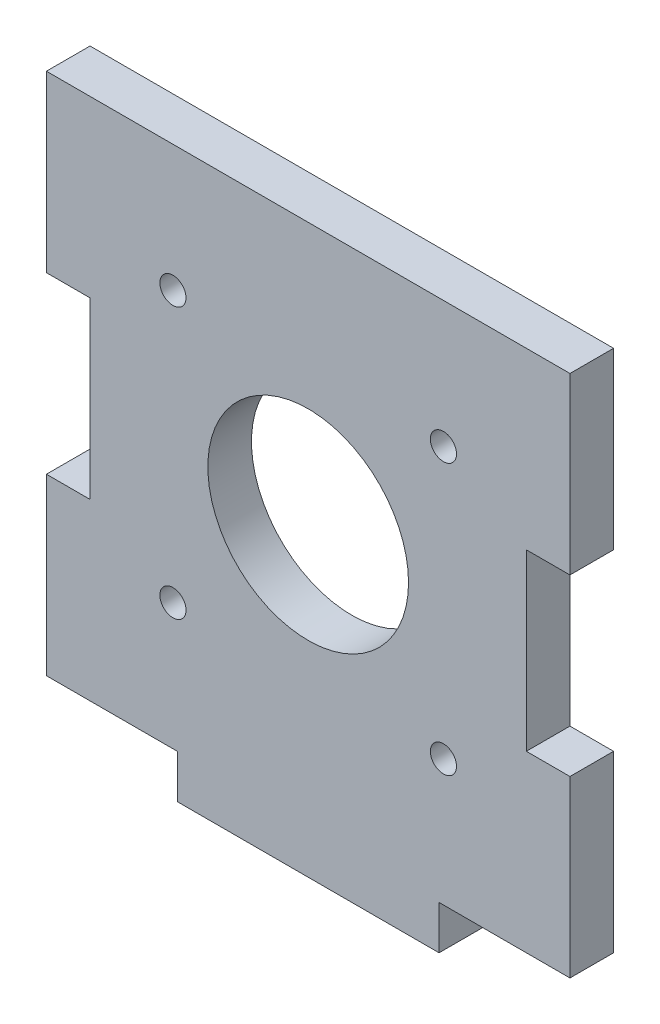
ISO-10303-21;
HEADER;
FILE_DESCRIPTION(('STEP AP214'),'2;1');
FILE_NAME('part.step','',(''),(''),'','','');
FILE_SCHEMA(('AUTOMOTIVE_DESIGN { 1 0 10303 214 1 1 1 1 }'));
ENDSEC;
DATA;
#1=APPLICATION_CONTEXT('core data for automotive mechanical design processes');
#2=APPLICATION_PROTOCOL_DEFINITION('international standard','automotive_design',2000,#1);
#3=PRODUCT_CONTEXT('',#1,'mechanical');
#4=PRODUCT('Part','Part','',(#3));
#5=PRODUCT_RELATED_PRODUCT_CATEGORY('part','',(#4));
#6=PRODUCT_DEFINITION_FORMATION('','',#4);
#7=PRODUCT_DEFINITION_CONTEXT('part definition',#1,'design');
#8=PRODUCT_DEFINITION('design','',#6,#7);
#9=PRODUCT_DEFINITION_SHAPE('','',#8);
#10=(LENGTH_UNIT() NAMED_UNIT(*) SI_UNIT(.MILLI.,.METRE.));
#11=(NAMED_UNIT(*) PLANE_ANGLE_UNIT() SI_UNIT($,.RADIAN.));
#12=(NAMED_UNIT(*) SI_UNIT($,.STERADIAN.) SOLID_ANGLE_UNIT());
#13=UNCERTAINTY_MEASURE_WITH_UNIT(LENGTH_MEASURE(1.E-05),#10,'distance_accuracy_value','');
#14=(GEOMETRIC_REPRESENTATION_CONTEXT(3) GLOBAL_UNCERTAINTY_ASSIGNED_CONTEXT((#13)) GLOBAL_UNIT_ASSIGNED_CONTEXT((#10,
#11,#12)) REPRESENTATION_CONTEXT('',''));
#15=CARTESIAN_POINT('',(0.,0.,0.));
#16=DIRECTION('',(0.,0.,1.));
#17=DIRECTION('',(1.,0.,0.));
#18=AXIS2_PLACEMENT_3D('',#15,#16,#17);
#19=CARTESIAN_POINT('',(0.,0.,5.));
#20=DIRECTION('',(0.,0.,-1.));
#21=DIRECTION('',(-1.,0.,0.));
#22=AXIS2_PLACEMENT_3D('',#19,#20,#21);
#23=PLANE('',#22);
#24=DIRECTION('',(0.,-1.,0.));
#25=VECTOR('',#24,1.);
#26=CARTESIAN_POINT('',(0.,0.,5.));
#27=LINE('',#26,#25);
#28=CARTESIAN_POINT('',(0.,20.,5.));
#29=VERTEX_POINT('',#28);
#30=CARTESIAN_POINT('',(0.,0.,5.));
#31=VERTEX_POINT('',#30);
#32=EDGE_CURVE('E213',#29,#31,#27,.T.);
#33=ORIENTED_EDGE('',*,*,#32,.T.);
#34=DIRECTION('',(1.,0.,0.));
#35=VECTOR('',#34,1.);
#36=CARTESIAN_POINT('',(0.,0.,5.));
#37=LINE('',#36,#35);
#38=CARTESIAN_POINT('',(15.,0.,5.));
#39=VERTEX_POINT('',#38);
#40=EDGE_CURVE('E121',#31,#39,#37,.T.);
#41=ORIENTED_EDGE('',*,*,#40,.T.);
#42=DIRECTION('',(0.,-1.,0.));
#43=VECTOR('',#42,1.);
#44=CARTESIAN_POINT('',(15.,0.,5.));
#45=LINE('',#44,#43);
#46=CARTESIAN_POINT('',(15.,-5.,5.));
#47=VERTEX_POINT('',#46);
#48=EDGE_CURVE('E252',#39,#47,#45,.T.);
#49=ORIENTED_EDGE('',*,*,#48,.T.);
#50=DIRECTION('',(1.,0.,0.));
#51=VECTOR('',#50,1.);
#52=CARTESIAN_POINT('',(15.,-5.,5.));
#53=LINE('',#52,#51);
#54=CARTESIAN_POINT('',(45.,-5.,5.));
#55=VERTEX_POINT('',#54);
#56=EDGE_CURVE('E271',#47,#55,#53,.T.);
#57=ORIENTED_EDGE('',*,*,#56,.T.);
#58=DIRECTION('',(0.,1.,0.));
#59=VECTOR('',#58,1.);
#60=CARTESIAN_POINT('',(45.,0.,5.));
#61=LINE('',#60,#59);
#62=CARTESIAN_POINT('',(45.,0.,5.));
#63=VERTEX_POINT('',#62);
#64=EDGE_CURVE('E268',#55,#63,#61,.T.);
#65=ORIENTED_EDGE('',*,*,#64,.T.);
#66=DIRECTION('',(1.,0.,0.));
#67=VECTOR('',#66,1.);
#68=CARTESIAN_POINT('',(45.,0.,5.));
#69=LINE('',#68,#67);
#70=CARTESIAN_POINT('',(60.,0.,5.));
#71=VERTEX_POINT('',#70);
#72=EDGE_CURVE('E270',#63,#71,#69,.T.);
#73=ORIENTED_EDGE('',*,*,#72,.T.);
#74=DIRECTION('',(0.,1.,0.));
#75=VECTOR('',#74,1.);
#76=CARTESIAN_POINT('',(60.,0.,5.));
#77=LINE('',#76,#75);
#78=CARTESIAN_POINT('',(60.,20.,5.));
#79=VERTEX_POINT('',#78);
#80=EDGE_CURVE('E273',#71,#79,#77,.T.);
#81=ORIENTED_EDGE('',*,*,#80,.T.);
#82=DIRECTION('',(-1.,0.,0.));
#83=VECTOR('',#82,1.);
#84=CARTESIAN_POINT('',(60.,20.,5.));
#85=LINE('',#84,#83);
#86=CARTESIAN_POINT('',(55.,20.,5.));
#87=VERTEX_POINT('',#86);
#88=EDGE_CURVE('E279',#79,#87,#85,.T.);
#89=ORIENTED_EDGE('',*,*,#88,.T.);
#90=DIRECTION('',(0.,1.,0.));
#91=VECTOR('',#90,1.);
#92=CARTESIAN_POINT('',(55.,40.,5.));
#93=LINE('',#92,#91);
#94=CARTESIAN_POINT('',(55.,40.,5.));
#95=VERTEX_POINT('',#94);
#96=EDGE_CURVE('E281',#87,#95,#93,.T.);
#97=ORIENTED_EDGE('',*,*,#96,.T.);
#98=DIRECTION('',(1.,0.,0.));
#99=VECTOR('',#98,1.);
#100=CARTESIAN_POINT('',(60.,40.,5.));
#101=LINE('',#100,#99);
#102=CARTESIAN_POINT('',(60.,40.,5.));
#103=VERTEX_POINT('',#102);
#104=EDGE_CURVE('E283',#95,#103,#101,.T.);
#105=ORIENTED_EDGE('',*,*,#104,.T.);
#106=DIRECTION('',(0.,1.,0.));
#107=VECTOR('',#106,1.);
#108=CARTESIAN_POINT('',(60.,40.,5.));
#109=LINE('',#108,#107);
#110=CARTESIAN_POINT('',(60.,60.,5.));
#111=VERTEX_POINT('',#110);
#112=EDGE_CURVE('E285',#103,#111,#109,.T.);
#113=ORIENTED_EDGE('',*,*,#112,.T.);
#114=DIRECTION('',(-1.,0.,0.));
#115=VECTOR('',#114,1.);
#116=CARTESIAN_POINT('',(0.,60.,5.));
#117=LINE('',#116,#115);
#118=CARTESIAN_POINT('',(0.,60.,5.));
#119=VERTEX_POINT('',#118);
#120=EDGE_CURVE('E287',#111,#119,#117,.T.);
#121=ORIENTED_EDGE('',*,*,#120,.T.);
#122=DIRECTION('',(0.,-1.,0.));
#123=VECTOR('',#122,1.);
#124=CARTESIAN_POINT('',(0.,40.,5.));
#125=LINE('',#124,#123);
#126=CARTESIAN_POINT('',(0.,40.,5.));
#127=VERTEX_POINT('',#126);
#128=EDGE_CURVE('E164',#119,#127,#125,.T.);
#129=ORIENTED_EDGE('',*,*,#128,.T.);
#130=DIRECTION('',(1.,0.,0.));
#131=VECTOR('',#130,1.);
#132=CARTESIAN_POINT('',(0.,40.,5.));
#133=LINE('',#132,#131);
#134=CARTESIAN_POINT('',(5.,40.,5.));
#135=VERTEX_POINT('',#134);
#136=EDGE_CURVE('E158',#127,#135,#133,.T.);
#137=ORIENTED_EDGE('',*,*,#136,.T.);
#138=DIRECTION('',(0.,-1.,0.));
#139=VECTOR('',#138,1.);
#140=CARTESIAN_POINT('',(5.,40.,5.));
#141=LINE('',#140,#139);
#142=CARTESIAN_POINT('',(5.,20.,5.));
#143=VERTEX_POINT('',#142);
#144=EDGE_CURVE('E162',#135,#143,#141,.T.);
#145=ORIENTED_EDGE('',*,*,#144,.T.);
#146=DIRECTION('',(-1.,0.,0.));
#147=VECTOR('',#146,1.);
#148=CARTESIAN_POINT('',(0.,20.,5.));
#149=LINE('',#148,#147);
#150=EDGE_CURVE('E54',#143,#29,#149,.T.);
#151=ORIENTED_EDGE('',*,*,#150,.T.);
#152=EDGE_LOOP('',(#33,#41,#49,#57,#65,#73,#81,#89,#97,#105,#113,#121,#129,#137,#145,#151));
#153=FACE_BOUND('',#152,.T.);
#154=CARTESIAN_POINT('',(30.,30.,5.));
#155=DIRECTION('',(0.,0.,1.));
#156=DIRECTION('',(1.,0.,0.));
#157=AXIS2_PLACEMENT_3D('',#154,#155,#156);
#158=CIRCLE('',#157,11.5);
#159=CARTESIAN_POINT('',(41.5,30.,5.));
#160=VERTEX_POINT('',#159);
#161=EDGE_CURVE('E186',#160,#160,#158,.T.);
#162=ORIENTED_EDGE('',*,*,#161,.F.);
#163=EDGE_LOOP('',(#162));
#164=FACE_BOUND('',#163,.T.);
#165=CARTESIAN_POINT('',(14.5,45.5,5.));
#166=DIRECTION('',(0.,0.,1.));
#167=DIRECTION('',(1.,0.,0.));
#168=AXIS2_PLACEMENT_3D('',#165,#166,#167);
#169=CIRCLE('',#168,1.5);
#170=CARTESIAN_POINT('',(16.,45.5,5.));
#171=VERTEX_POINT('',#170);
#172=EDGE_CURVE('E361',#171,#171,#169,.T.);
#173=ORIENTED_EDGE('',*,*,#172,.F.);
#174=EDGE_LOOP('',(#173));
#175=FACE_BOUND('',#174,.T.);
#176=CARTESIAN_POINT('',(45.5,45.5,5.));
#177=DIRECTION('',(0.,0.,1.));
#178=DIRECTION('',(1.,0.,0.));
#179=AXIS2_PLACEMENT_3D('',#176,#177,#178);
#180=CIRCLE('',#179,1.5);
#181=CARTESIAN_POINT('',(47.,45.5,5.));
#182=VERTEX_POINT('',#181);
#183=EDGE_CURVE('E355',#182,#182,#180,.T.);
#184=ORIENTED_EDGE('',*,*,#183,.F.);
#185=EDGE_LOOP('',(#184));
#186=FACE_BOUND('',#185,.T.);
#187=CARTESIAN_POINT('',(45.5,14.5,5.));
#188=DIRECTION('',(0.,0.,1.));
#189=DIRECTION('',(1.,0.,0.));
#190=AXIS2_PLACEMENT_3D('',#187,#188,#189);
#191=CIRCLE('',#190,1.5);
#192=CARTESIAN_POINT('',(47.,14.5,5.));
#193=VERTEX_POINT('',#192);
#194=EDGE_CURVE('E349',#193,#193,#191,.T.);
#195=ORIENTED_EDGE('',*,*,#194,.F.);
#196=EDGE_LOOP('',(#195));
#197=FACE_BOUND('',#196,.T.);
#198=CARTESIAN_POINT('',(14.5,14.5,5.));
#199=DIRECTION('',(0.,0.,1.));
#200=DIRECTION('',(1.,0.,0.));
#201=AXIS2_PLACEMENT_3D('',#198,#199,#200);
#202=CIRCLE('',#201,1.5);
#203=CARTESIAN_POINT('',(16.,14.5,5.));
#204=VERTEX_POINT('',#203);
#205=EDGE_CURVE('E340',#204,#204,#202,.T.);
#206=ORIENTED_EDGE('',*,*,#205,.F.);
#207=EDGE_LOOP('',(#206));
#208=FACE_BOUND('',#207,.T.);
#209=ADVANCED_FACE('F37',(#153,#164,#175,#186,#197,#208),#23,.F.);
#210=CARTESIAN_POINT('',(0.,0.,0.));
#211=DIRECTION('',(0.,0.,-1.));
#212=DIRECTION('',(-1.,0.,0.));
#213=AXIS2_PLACEMENT_3D('',#210,#211,#212);
#214=PLANE('',#213);
#215=CARTESIAN_POINT('',(45.5,14.5,0.));
#216=DIRECTION('',(0.,0.,1.));
#217=DIRECTION('',(1.,0.,0.));
#218=AXIS2_PLACEMENT_3D('',#215,#216,#217);
#219=CIRCLE('',#218,1.5);
#220=CARTESIAN_POINT('',(47.,14.5,0.));
#221=VERTEX_POINT('',#220);
#222=EDGE_CURVE('E346',#221,#221,#219,.T.);
#223=ORIENTED_EDGE('',*,*,#222,.T.);
#224=EDGE_LOOP('',(#223));
#225=FACE_BOUND('',#224,.T.);
#226=CARTESIAN_POINT('',(14.5,45.5,0.));
#227=DIRECTION('',(0.,0.,1.));
#228=DIRECTION('',(1.,0.,0.));
#229=AXIS2_PLACEMENT_3D('',#226,#227,#228);
#230=CIRCLE('',#229,1.5);
#231=CARTESIAN_POINT('',(16.,45.5,0.));
#232=VERTEX_POINT('',#231);
#233=EDGE_CURVE('E358',#232,#232,#230,.T.);
#234=ORIENTED_EDGE('',*,*,#233,.T.);
#235=EDGE_LOOP('',(#234));
#236=FACE_BOUND('',#235,.T.);
#237=DIRECTION('',(0.,-1.,0.));
#238=VECTOR('',#237,1.);
#239=CARTESIAN_POINT('',(0.,0.,0.));
#240=LINE('',#239,#238);
#241=CARTESIAN_POINT('',(0.,20.,0.));
#242=VERTEX_POINT('',#241);
#243=CARTESIAN_POINT('',(0.,0.,0.));
#244=VERTEX_POINT('',#243);
#245=EDGE_CURVE('E182',#242,#244,#240,.T.);
#246=ORIENTED_EDGE('',*,*,#245,.F.);
#247=DIRECTION('',(-1.,0.,0.));
#248=VECTOR('',#247,1.);
#249=CARTESIAN_POINT('',(0.,20.,0.));
#250=LINE('',#249,#248);
#251=CARTESIAN_POINT('',(5.,20.,0.));
#252=VERTEX_POINT('',#251);
#253=EDGE_CURVE('E113',#252,#242,#250,.T.);
#254=ORIENTED_EDGE('',*,*,#253,.F.);
#255=DIRECTION('',(0.,-1.,0.));
#256=VECTOR('',#255,1.);
#257=CARTESIAN_POINT('',(5.,40.,0.));
#258=LINE('',#257,#256);
#259=CARTESIAN_POINT('',(5.,40.,0.));
#260=VERTEX_POINT('',#259);
#261=EDGE_CURVE('E107',#260,#252,#258,.T.);
#262=ORIENTED_EDGE('',*,*,#261,.F.);
#263=DIRECTION('',(1.,0.,0.));
#264=VECTOR('',#263,1.);
#265=CARTESIAN_POINT('',(0.,40.,0.));
#266=LINE('',#265,#264);
#267=CARTESIAN_POINT('',(0.,40.,0.));
#268=VERTEX_POINT('',#267);
#269=EDGE_CURVE('E172',#268,#260,#266,.T.);
#270=ORIENTED_EDGE('',*,*,#269,.F.);
#271=DIRECTION('',(0.,-1.,0.));
#272=VECTOR('',#271,1.);
#273=CARTESIAN_POINT('',(0.,40.,0.));
#274=LINE('',#273,#272);
#275=CARTESIAN_POINT('',(0.,60.,0.));
#276=VERTEX_POINT('',#275);
#277=EDGE_CURVE('E208',#276,#268,#274,.T.);
#278=ORIENTED_EDGE('',*,*,#277,.F.);
#279=DIRECTION('',(-1.,0.,0.));
#280=VECTOR('',#279,1.);
#281=CARTESIAN_POINT('',(0.,60.,0.));
#282=LINE('',#281,#280);
#283=CARTESIAN_POINT('',(60.,60.,0.));
#284=VERTEX_POINT('',#283);
#285=EDGE_CURVE('E206',#284,#276,#282,.T.);
#286=ORIENTED_EDGE('',*,*,#285,.F.);
#287=DIRECTION('',(0.,1.,0.));
#288=VECTOR('',#287,1.);
#289=CARTESIAN_POINT('',(60.,40.,0.));
#290=LINE('',#289,#288);
#291=CARTESIAN_POINT('',(60.,40.,0.));
#292=VERTEX_POINT('',#291);
#293=EDGE_CURVE('E204',#292,#284,#290,.T.);
#294=ORIENTED_EDGE('',*,*,#293,.F.);
#295=DIRECTION('',(1.,0.,0.));
#296=VECTOR('',#295,1.);
#297=CARTESIAN_POINT('',(60.,40.,0.));
#298=LINE('',#297,#296);
#299=CARTESIAN_POINT('',(55.,40.,0.));
#300=VERTEX_POINT('',#299);
#301=EDGE_CURVE('E202',#300,#292,#298,.T.);
#302=ORIENTED_EDGE('',*,*,#301,.F.);
#303=DIRECTION('',(0.,1.,0.));
#304=VECTOR('',#303,1.);
#305=CARTESIAN_POINT('',(55.,40.,0.));
#306=LINE('',#305,#304);
#307=CARTESIAN_POINT('',(55.,20.,0.));
#308=VERTEX_POINT('',#307);
#309=EDGE_CURVE('E200',#308,#300,#306,.T.);
#310=ORIENTED_EDGE('',*,*,#309,.F.);
#311=DIRECTION('',(-1.,0.,0.));
#312=VECTOR('',#311,1.);
#313=CARTESIAN_POINT('',(60.,20.,0.));
#314=LINE('',#313,#312);
#315=CARTESIAN_POINT('',(60.,20.,0.));
#316=VERTEX_POINT('',#315);
#317=EDGE_CURVE('E198',#316,#308,#314,.T.);
#318=ORIENTED_EDGE('',*,*,#317,.F.);
#319=DIRECTION('',(0.,1.,0.));
#320=VECTOR('',#319,1.);
#321=CARTESIAN_POINT('',(60.,0.,0.));
#322=LINE('',#321,#320);
#323=CARTESIAN_POINT('',(60.,0.,0.));
#324=VERTEX_POINT('',#323);
#325=EDGE_CURVE('E196',#324,#316,#322,.T.);
#326=ORIENTED_EDGE('',*,*,#325,.F.);
#327=DIRECTION('',(1.,0.,0.));
#328=VECTOR('',#327,1.);
#329=CARTESIAN_POINT('',(45.,0.,0.));
#330=LINE('',#329,#328);
#331=CARTESIAN_POINT('',(45.,0.,0.));
#332=VERTEX_POINT('',#331);
#333=EDGE_CURVE('E194',#332,#324,#330,.T.);
#334=ORIENTED_EDGE('',*,*,#333,.F.);
#335=DIRECTION('',(0.,1.,0.));
#336=VECTOR('',#335,1.);
#337=CARTESIAN_POINT('',(45.,0.,0.));
#338=LINE('',#337,#336);
#339=CARTESIAN_POINT('',(45.,-5.,0.));
#340=VERTEX_POINT('',#339);
#341=EDGE_CURVE('E192',#340,#332,#338,.T.);
#342=ORIENTED_EDGE('',*,*,#341,.F.);
#343=DIRECTION('',(1.,0.,0.));
#344=VECTOR('',#343,1.);
#345=CARTESIAN_POINT('',(15.,-5.,0.));
#346=LINE('',#345,#344);
#347=CARTESIAN_POINT('',(15.,-5.,0.));
#348=VERTEX_POINT('',#347);
#349=EDGE_CURVE('E190',#348,#340,#346,.T.);
#350=ORIENTED_EDGE('',*,*,#349,.F.);
#351=DIRECTION('',(0.,-1.,0.));
#352=VECTOR('',#351,1.);
#353=CARTESIAN_POINT('',(15.,0.,0.));
#354=LINE('',#353,#352);
#355=CARTESIAN_POINT('',(15.,0.,0.));
#356=VERTEX_POINT('',#355);
#357=EDGE_CURVE('E188',#356,#348,#354,.T.);
#358=ORIENTED_EDGE('',*,*,#357,.F.);
#359=DIRECTION('',(1.,0.,0.));
#360=VECTOR('',#359,1.);
#361=CARTESIAN_POINT('',(0.,0.,0.));
#362=LINE('',#361,#360);
#363=EDGE_CURVE('E185',#244,#356,#362,.T.);
#364=ORIENTED_EDGE('',*,*,#363,.F.);
#365=EDGE_LOOP('',(#246,#254,#262,#270,#278,#286,#294,#302,#310,#318,#326,#334,#342,#350,#358,#364));
#366=FACE_BOUND('',#365,.T.);
#367=CARTESIAN_POINT('',(30.,30.,0.));
#368=DIRECTION('',(0.,0.,1.));
#369=DIRECTION('',(1.,0.,0.));
#370=AXIS2_PLACEMENT_3D('',#367,#368,#369);
#371=CIRCLE('',#370,11.5);
#372=CARTESIAN_POINT('',(41.5,30.,0.));
#373=VERTEX_POINT('',#372);
#374=EDGE_CURVE('E364',#373,#373,#371,.T.);
#375=ORIENTED_EDGE('',*,*,#374,.T.);
#376=EDGE_LOOP('',(#375));
#377=FACE_BOUND('',#376,.T.);
#378=CARTESIAN_POINT('',(45.5,45.5,0.));
#379=DIRECTION('',(0.,0.,1.));
#380=DIRECTION('',(1.,0.,0.));
#381=AXIS2_PLACEMENT_3D('',#378,#379,#380);
#382=CIRCLE('',#381,1.5);
#383=CARTESIAN_POINT('',(47.,45.5,0.));
#384=VERTEX_POINT('',#383);
#385=EDGE_CURVE('E352',#384,#384,#382,.T.);
#386=ORIENTED_EDGE('',*,*,#385,.T.);
#387=EDGE_LOOP('',(#386));
#388=FACE_BOUND('',#387,.T.);
#389=CARTESIAN_POINT('',(14.5,14.5,0.));
#390=DIRECTION('',(0.,0.,1.));
#391=DIRECTION('',(1.,0.,0.));
#392=AXIS2_PLACEMENT_3D('',#389,#390,#391);
#393=CIRCLE('',#392,1.5);
#394=CARTESIAN_POINT('',(16.,14.5,0.));
#395=VERTEX_POINT('',#394);
#396=EDGE_CURVE('E343',#395,#395,#393,.T.);
#397=ORIENTED_EDGE('',*,*,#396,.T.);
#398=EDGE_LOOP('',(#397));
#399=FACE_BOUND('',#398,.T.);
#400=ADVANCED_FACE('F256',(#225,#236,#366,#377,#388,#399),#214,.T.);
#401=CARTESIAN_POINT('',(0.,0.,5.));
#402=DIRECTION('',(1.,0.,0.));
#403=DIRECTION('',(0.,1.,0.));
#404=AXIS2_PLACEMENT_3D('',#401,#402,#403);
#405=PLANE('',#404);
#406=ORIENTED_EDGE('',*,*,#245,.T.);
#407=DIRECTION('',(0.,0.,-1.));
#408=VECTOR('',#407,1.);
#409=CARTESIAN_POINT('',(0.,0.,5.));
#410=LINE('',#409,#408);
#411=EDGE_CURVE('E11',#31,#244,#410,.T.);
#412=ORIENTED_EDGE('',*,*,#411,.F.);
#413=ORIENTED_EDGE('',*,*,#32,.F.);
#414=DIRECTION('',(0.,0.,-1.));
#415=VECTOR('',#414,1.);
#416=CARTESIAN_POINT('',(0.,20.,5.));
#417=LINE('',#416,#415);
#418=EDGE_CURVE('E178',#29,#242,#417,.T.);
#419=ORIENTED_EDGE('',*,*,#418,.T.);
#420=EDGE_LOOP('',(#406,#412,#413,#419));
#421=FACE_BOUND('',#420,.T.);
#422=ADVANCED_FACE('F39',(#421),#405,.F.);
#423=CARTESIAN_POINT('',(0.,0.,5.));
#424=DIRECTION('',(0.,1.,0.));
#425=DIRECTION('',(0.,0.,1.));
#426=AXIS2_PLACEMENT_3D('',#423,#424,#425);
#427=PLANE('',#426);
#428=ORIENTED_EDGE('',*,*,#363,.T.);
#429=DIRECTION('',(0.,0.,-1.));
#430=VECTOR('',#429,1.);
#431=CARTESIAN_POINT('',(15.,0.,5.));
#432=LINE('',#431,#430);
#433=EDGE_CURVE('E46',#39,#356,#432,.T.);
#434=ORIENTED_EDGE('',*,*,#433,.F.);
#435=ORIENTED_EDGE('',*,*,#40,.F.);
#436=ORIENTED_EDGE('',*,*,#411,.T.);
#437=EDGE_LOOP('',(#428,#434,#435,#436));
#438=FACE_BOUND('',#437,.T.);
#439=ADVANCED_FACE('F525',(#438),#427,.F.);
#440=CARTESIAN_POINT('',(15.,0.,5.));
#441=DIRECTION('',(1.,0.,0.));
#442=DIRECTION('',(0.,0.,-1.));
#443=AXIS2_PLACEMENT_3D('',#440,#441,#442);
#444=PLANE('',#443);
#445=ORIENTED_EDGE('',*,*,#357,.T.);
#446=DIRECTION('',(0.,0.,-1.));
#447=VECTOR('',#446,1.);
#448=CARTESIAN_POINT('',(15.,-5.,5.));
#449=LINE('',#448,#447);
#450=EDGE_CURVE('E244',#47,#348,#449,.T.);
#451=ORIENTED_EDGE('',*,*,#450,.F.);
#452=ORIENTED_EDGE('',*,*,#48,.F.);
#453=ORIENTED_EDGE('',*,*,#433,.T.);
#454=EDGE_LOOP('',(#445,#451,#452,#453));
#455=FACE_BOUND('',#454,.T.);
#456=ADVANCED_FACE('F250',(#455),#444,.F.);
#457=CARTESIAN_POINT('',(15.,-5.,5.));
#458=DIRECTION('',(0.,1.,0.));
#459=DIRECTION('',(0.,0.,1.));
#460=AXIS2_PLACEMENT_3D('',#457,#458,#459);
#461=PLANE('',#460);
#462=ORIENTED_EDGE('',*,*,#349,.T.);
#463=DIRECTION('',(0.,0.,-1.));
#464=VECTOR('',#463,1.);
#465=CARTESIAN_POINT('',(45.,-5.,5.));
#466=LINE('',#465,#464);
#467=EDGE_CURVE('E241',#55,#340,#466,.T.);
#468=ORIENTED_EDGE('',*,*,#467,.F.);
#469=ORIENTED_EDGE('',*,*,#56,.F.);
#470=ORIENTED_EDGE('',*,*,#450,.T.);
#471=EDGE_LOOP('',(#462,#468,#469,#470));
#472=FACE_BOUND('',#471,.T.);
#473=ADVANCED_FACE('F262',(#472),#461,.F.);
#474=CARTESIAN_POINT('',(45.,0.,5.));
#475=DIRECTION('',(-1.,0.,0.));
#476=DIRECTION('',(0.,0.,1.));
#477=AXIS2_PLACEMENT_3D('',#474,#475,#476);
#478=PLANE('',#477);
#479=ORIENTED_EDGE('',*,*,#341,.T.);
#480=DIRECTION('',(0.,0.,-1.));
#481=VECTOR('',#480,1.);
#482=CARTESIAN_POINT('',(45.,0.,5.));
#483=LINE('',#482,#481);
#484=EDGE_CURVE('E238',#63,#332,#483,.T.);
#485=ORIENTED_EDGE('',*,*,#484,.F.);
#486=ORIENTED_EDGE('',*,*,#64,.F.);
#487=ORIENTED_EDGE('',*,*,#467,.T.);
#488=EDGE_LOOP('',(#479,#485,#486,#487));
#489=FACE_BOUND('',#488,.T.);
#490=ADVANCED_FACE('F266',(#489),#478,.F.);
#491=CARTESIAN_POINT('',(45.,0.,5.));
#492=DIRECTION('',(0.,1.,0.));
#493=DIRECTION('',(0.,0.,1.));
#494=AXIS2_PLACEMENT_3D('',#491,#492,#493);
#495=PLANE('',#494);
#496=ORIENTED_EDGE('',*,*,#333,.T.);
#497=DIRECTION('',(0.,0.,-1.));
#498=VECTOR('',#497,1.);
#499=CARTESIAN_POINT('',(60.,0.,5.));
#500=LINE('',#499,#498);
#501=EDGE_CURVE('E235',#71,#324,#500,.T.);
#502=ORIENTED_EDGE('',*,*,#501,.F.);
#503=ORIENTED_EDGE('',*,*,#72,.F.);
#504=ORIENTED_EDGE('',*,*,#484,.T.);
#505=EDGE_LOOP('',(#496,#502,#503,#504));
#506=FACE_BOUND('',#505,.T.);
#507=ADVANCED_FACE('F490',(#506),#495,.F.);
#508=CARTESIAN_POINT('',(60.,0.,5.));
#509=DIRECTION('',(-1.,0.,0.));
#510=DIRECTION('',(0.,0.,1.));
#511=AXIS2_PLACEMENT_3D('',#508,#509,#510);
#512=PLANE('',#511);
#513=ORIENTED_EDGE('',*,*,#325,.T.);
#514=DIRECTION('',(0.,0.,-1.));
#515=VECTOR('',#514,1.);
#516=CARTESIAN_POINT('',(60.,20.,5.));
#517=LINE('',#516,#515);
#518=EDGE_CURVE('E232',#79,#316,#517,.T.);
#519=ORIENTED_EDGE('',*,*,#518,.F.);
#520=ORIENTED_EDGE('',*,*,#80,.F.);
#521=ORIENTED_EDGE('',*,*,#501,.T.);
#522=EDGE_LOOP('',(#513,#519,#520,#521));
#523=FACE_BOUND('',#522,.T.);
#524=ADVANCED_FACE('F480',(#523),#512,.F.);
#525=CARTESIAN_POINT('',(60.,20.,5.));
#526=DIRECTION('',(0.,-1.,0.));
#527=DIRECTION('',(0.,0.,-1.));
#528=AXIS2_PLACEMENT_3D('',#525,#526,#527);
#529=PLANE('',#528);
#530=ORIENTED_EDGE('',*,*,#317,.T.);
#531=DIRECTION('',(0.,0.,-1.));
#532=VECTOR('',#531,1.);
#533=CARTESIAN_POINT('',(55.,20.,5.));
#534=LINE('',#533,#532);
#535=EDGE_CURVE('E229',#87,#308,#534,.T.);
#536=ORIENTED_EDGE('',*,*,#535,.F.);
#537=ORIENTED_EDGE('',*,*,#88,.F.);
#538=ORIENTED_EDGE('',*,*,#518,.T.);
#539=EDGE_LOOP('',(#530,#536,#537,#538));
#540=FACE_BOUND('',#539,.T.);
#541=ADVANCED_FACE('F470',(#540),#529,.F.);
#542=CARTESIAN_POINT('',(55.,40.,5.));
#543=DIRECTION('',(-1.,0.,0.));
#544=DIRECTION('',(0.,0.,1.));
#545=AXIS2_PLACEMENT_3D('',#542,#543,#544);
#546=PLANE('',#545);
#547=ORIENTED_EDGE('',*,*,#309,.T.);
#548=DIRECTION('',(0.,0.,-1.));
#549=VECTOR('',#548,1.);
#550=CARTESIAN_POINT('',(55.,40.,5.));
#551=LINE('',#550,#549);
#552=EDGE_CURVE('E226',#95,#300,#551,.T.);
#553=ORIENTED_EDGE('',*,*,#552,.F.);
#554=ORIENTED_EDGE('',*,*,#96,.F.);
#555=ORIENTED_EDGE('',*,*,#535,.T.);
#556=EDGE_LOOP('',(#547,#553,#554,#555));
#557=FACE_BOUND('',#556,.T.);
#558=ADVANCED_FACE('F460',(#557),#546,.F.);
#559=CARTESIAN_POINT('',(60.,40.,5.));
#560=DIRECTION('',(0.,1.,0.));
#561=DIRECTION('',(0.,0.,1.));
#562=AXIS2_PLACEMENT_3D('',#559,#560,#561);
#563=PLANE('',#562);
#564=ORIENTED_EDGE('',*,*,#301,.T.);
#565=DIRECTION('',(0.,0.,-1.));
#566=VECTOR('',#565,1.);
#567=CARTESIAN_POINT('',(60.,40.,5.));
#568=LINE('',#567,#566);
#569=EDGE_CURVE('E223',#103,#292,#568,.T.);
#570=ORIENTED_EDGE('',*,*,#569,.F.);
#571=ORIENTED_EDGE('',*,*,#104,.F.);
#572=ORIENTED_EDGE('',*,*,#552,.T.);
#573=EDGE_LOOP('',(#564,#570,#571,#572));
#574=FACE_BOUND('',#573,.T.);
#575=ADVANCED_FACE('F450',(#574),#563,.F.);
#576=CARTESIAN_POINT('',(60.,40.,5.));
#577=DIRECTION('',(-1.,0.,0.));
#578=DIRECTION('',(0.,-1.,0.));
#579=AXIS2_PLACEMENT_3D('',#576,#577,#578);
#580=PLANE('',#579);
#581=ORIENTED_EDGE('',*,*,#293,.T.);
#582=DIRECTION('',(0.,0.,-1.));
#583=VECTOR('',#582,1.);
#584=CARTESIAN_POINT('',(60.,60.,5.));
#585=LINE('',#584,#583);
#586=EDGE_CURVE('E220',#111,#284,#585,.T.);
#587=ORIENTED_EDGE('',*,*,#586,.F.);
#588=ORIENTED_EDGE('',*,*,#112,.F.);
#589=ORIENTED_EDGE('',*,*,#569,.T.);
#590=EDGE_LOOP('',(#581,#587,#588,#589));
#591=FACE_BOUND('',#590,.T.);
#592=ADVANCED_FACE('F441',(#591),#580,.F.);
#593=CARTESIAN_POINT('',(0.,60.,5.));
#594=DIRECTION('',(0.,-1.,0.));
#595=DIRECTION('',(1.,0.,0.));
#596=AXIS2_PLACEMENT_3D('',#593,#594,#595);
#597=PLANE('',#596);
#598=ORIENTED_EDGE('',*,*,#285,.T.);
#599=DIRECTION('',(0.,0.,-1.));
#600=VECTOR('',#599,1.);
#601=CARTESIAN_POINT('',(0.,60.,5.));
#602=LINE('',#601,#600);
#603=EDGE_CURVE('E217',#119,#276,#602,.T.);
#604=ORIENTED_EDGE('',*,*,#603,.F.);
#605=ORIENTED_EDGE('',*,*,#120,.F.);
#606=ORIENTED_EDGE('',*,*,#586,.T.);
#607=EDGE_LOOP('',(#598,#604,#605,#606));
#608=FACE_BOUND('',#607,.T.);
#609=ADVANCED_FACE('F293',(#608),#597,.F.);
#610=CARTESIAN_POINT('',(0.,40.,5.));
#611=DIRECTION('',(1.,0.,0.));
#612=DIRECTION('',(0.,1.,0.));
#613=AXIS2_PLACEMENT_3D('',#610,#611,#612);
#614=PLANE('',#613);
#615=ORIENTED_EDGE('',*,*,#277,.T.);
#616=DIRECTION('',(0.,0.,-1.));
#617=VECTOR('',#616,1.);
#618=CARTESIAN_POINT('',(0.,40.,5.));
#619=LINE('',#618,#617);
#620=EDGE_CURVE('E173',#127,#268,#619,.T.);
#621=ORIENTED_EDGE('',*,*,#620,.F.);
#622=ORIENTED_EDGE('',*,*,#128,.F.);
#623=ORIENTED_EDGE('',*,*,#603,.T.);
#624=EDGE_LOOP('',(#615,#621,#622,#623));
#625=FACE_BOUND('',#624,.T.);
#626=ADVANCED_FACE('F297',(#625),#614,.F.);
#627=CARTESIAN_POINT('',(0.,40.,5.));
#628=DIRECTION('',(0.,1.,0.));
#629=DIRECTION('',(0.,0.,1.));
#630=AXIS2_PLACEMENT_3D('',#627,#628,#629);
#631=PLANE('',#630);
#632=ORIENTED_EDGE('',*,*,#269,.T.);
#633=DIRECTION('',(0.,0.,-1.));
#634=VECTOR('',#633,1.);
#635=CARTESIAN_POINT('',(5.,40.,5.));
#636=LINE('',#635,#634);
#637=EDGE_CURVE('E169',#135,#260,#636,.T.);
#638=ORIENTED_EDGE('',*,*,#637,.F.);
#639=ORIENTED_EDGE('',*,*,#136,.F.);
#640=ORIENTED_EDGE('',*,*,#620,.T.);
#641=EDGE_LOOP('',(#632,#638,#639,#640));
#642=FACE_BOUND('',#641,.T.);
#643=ADVANCED_FACE('F170',(#642),#631,.F.);
#644=CARTESIAN_POINT('',(5.,40.,5.));
#645=DIRECTION('',(1.,0.,0.));
#646=DIRECTION('',(0.,1.,0.));
#647=AXIS2_PLACEMENT_3D('',#644,#645,#646);
#648=PLANE('',#647);
#649=ORIENTED_EDGE('',*,*,#261,.T.);
#650=DIRECTION('',(0.,0.,-1.));
#651=VECTOR('',#650,1.);
#652=CARTESIAN_POINT('',(5.,20.,5.));
#653=LINE('',#652,#651);
#654=EDGE_CURVE('E174',#143,#252,#653,.T.);
#655=ORIENTED_EDGE('',*,*,#654,.F.);
#656=ORIENTED_EDGE('',*,*,#144,.F.);
#657=ORIENTED_EDGE('',*,*,#637,.T.);
#658=EDGE_LOOP('',(#649,#655,#656,#657));
#659=FACE_BOUND('',#658,.T.);
#660=ADVANCED_FACE('F176',(#659),#648,.F.);
#661=CARTESIAN_POINT('',(0.,20.,5.));
#662=DIRECTION('',(0.,-1.,0.));
#663=DIRECTION('',(0.,0.,-1.));
#664=AXIS2_PLACEMENT_3D('',#661,#662,#663);
#665=PLANE('',#664);
#666=ORIENTED_EDGE('',*,*,#253,.T.);
#667=ORIENTED_EDGE('',*,*,#418,.F.);
#668=ORIENTED_EDGE('',*,*,#150,.F.);
#669=ORIENTED_EDGE('',*,*,#654,.T.);
#670=EDGE_LOOP('',(#666,#667,#668,#669));
#671=FACE_BOUND('',#670,.T.);
#672=ADVANCED_FACE('F301',(#671),#665,.F.);
#673=CARTESIAN_POINT('',(30.,30.,5.));
#674=DIRECTION('',(0.,0.,-1.));
#675=DIRECTION('',(-1.,0.,0.));
#676=AXIS2_PLACEMENT_3D('',#673,#674,#675);
#677=CYLINDRICAL_SURFACE('',#676,11.5);
#678=ORIENTED_EDGE('',*,*,#161,.T.);
#679=EDGE_LOOP('',(#678));
#680=FACE_BOUND('',#679,.T.);
#681=ORIENTED_EDGE('',*,*,#374,.F.);
#682=EDGE_LOOP('',(#681));
#683=FACE_BOUND('',#682,.T.);
#684=ADVANCED_FACE('F303',(#680,#683),#677,.F.);
#685=CARTESIAN_POINT('',(14.5,45.5,5.));
#686=DIRECTION('',(0.,0.,-1.));
#687=DIRECTION('',(-1.,0.,0.));
#688=AXIS2_PLACEMENT_3D('',#685,#686,#687);
#689=CYLINDRICAL_SURFACE('',#688,1.5);
#690=ORIENTED_EDGE('',*,*,#172,.T.);
#691=EDGE_LOOP('',(#690));
#692=FACE_BOUND('',#691,.T.);
#693=ORIENTED_EDGE('',*,*,#233,.F.);
#694=EDGE_LOOP('',(#693));
#695=FACE_BOUND('',#694,.T.);
#696=ADVANCED_FACE('F309',(#692,#695),#689,.F.);
#697=CARTESIAN_POINT('',(45.5,45.5,5.));
#698=DIRECTION('',(0.,0.,-1.));
#699=DIRECTION('',(-1.,0.,0.));
#700=AXIS2_PLACEMENT_3D('',#697,#698,#699);
#701=CYLINDRICAL_SURFACE('',#700,1.5);
#702=ORIENTED_EDGE('',*,*,#183,.T.);
#703=EDGE_LOOP('',(#702));
#704=FACE_BOUND('',#703,.T.);
#705=ORIENTED_EDGE('',*,*,#385,.F.);
#706=EDGE_LOOP('',(#705));
#707=FACE_BOUND('',#706,.T.);
#708=ADVANCED_FACE('F323',(#704,#707),#701,.F.);
#709=CARTESIAN_POINT('',(45.5,14.5,5.));
#710=DIRECTION('',(0.,0.,-1.));
#711=DIRECTION('',(-1.,0.,0.));
#712=AXIS2_PLACEMENT_3D('',#709,#710,#711);
#713=CYLINDRICAL_SURFACE('',#712,1.5);
#714=ORIENTED_EDGE('',*,*,#194,.T.);
#715=EDGE_LOOP('',(#714));
#716=FACE_BOUND('',#715,.T.);
#717=ORIENTED_EDGE('',*,*,#222,.F.);
#718=EDGE_LOOP('',(#717));
#719=FACE_BOUND('',#718,.T.);
#720=ADVANCED_FACE('F327',(#716,#719),#713,.F.);
#721=CARTESIAN_POINT('',(14.5,14.5,5.));
#722=DIRECTION('',(0.,0.,-1.));
#723=DIRECTION('',(-1.,0.,0.));
#724=AXIS2_PLACEMENT_3D('',#721,#722,#723);
#725=CYLINDRICAL_SURFACE('',#724,1.5);
#726=ORIENTED_EDGE('',*,*,#205,.T.);
#727=EDGE_LOOP('',(#726));
#728=FACE_BOUND('',#727,.T.);
#729=ORIENTED_EDGE('',*,*,#396,.F.);
#730=EDGE_LOOP('',(#729));
#731=FACE_BOUND('',#730,.T.);
#732=ADVANCED_FACE('F331',(#728,#731),#725,.F.);
#733=CLOSED_SHELL('',(#209,#400,#422,#439,#456,#473,#490,#507,#524,#541,#558,#575,#592,#609,
#626,#643,#660,#672,#684,#696,#708,#720,#732));
#734=MANIFOLD_SOLID_BREP('B2',#733);
#735=ADVANCED_BREP_SHAPE_REPRESENTATION('',(#18,#734),#14);
#736=SHAPE_DEFINITION_REPRESENTATION(#9,#735);
ENDSEC;
END-ISO-10303-21;
